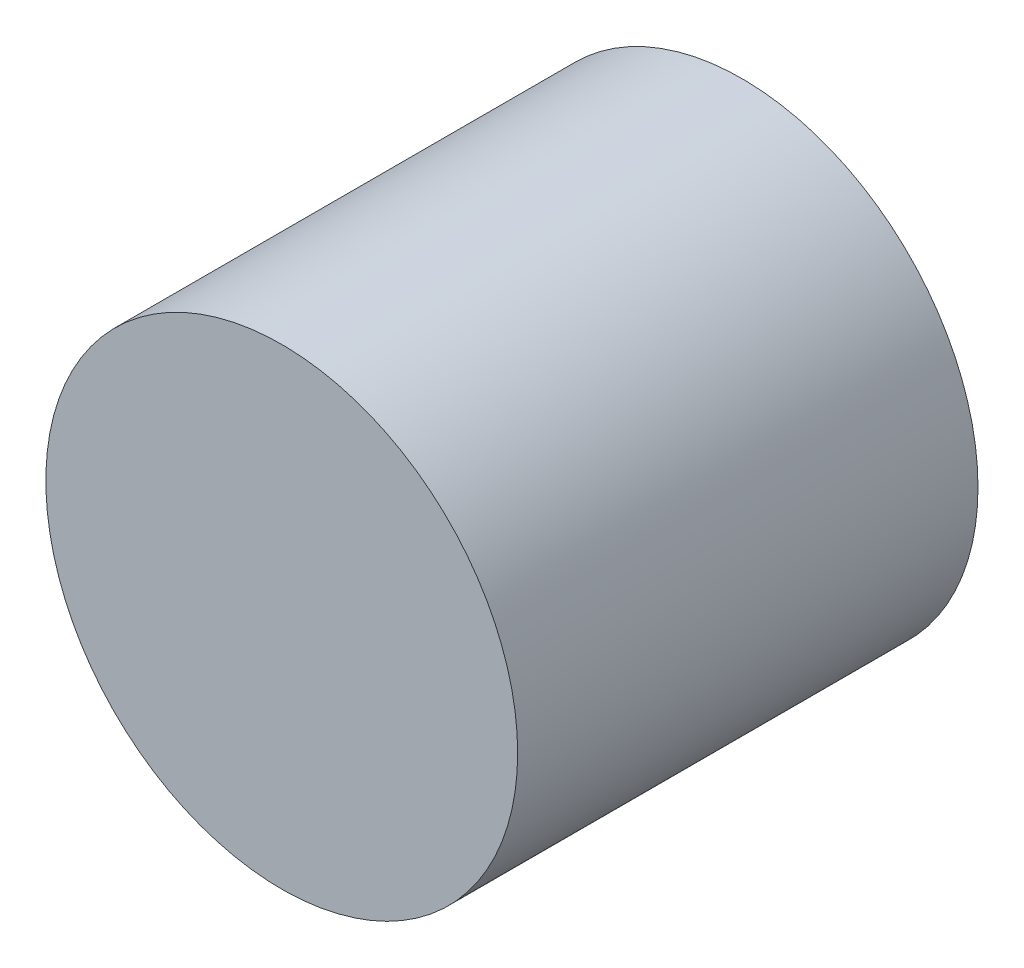
ISO-10303-21;
HEADER;
FILE_DESCRIPTION(('STEP AP214'),'2;1');
FILE_NAME('part.step','',(''),(''),'','','');
FILE_SCHEMA(('AUTOMOTIVE_DESIGN { 1 0 10303 214 1 1 1 1 }'));
ENDSEC;
DATA;
#1=APPLICATION_CONTEXT('core data for automotive mechanical design processes');
#2=APPLICATION_PROTOCOL_DEFINITION('international standard','automotive_design',2000,#1);
#3=PRODUCT_CONTEXT('',#1,'mechanical');
#4=PRODUCT('Part','Part','',(#3));
#5=PRODUCT_RELATED_PRODUCT_CATEGORY('part','',(#4));
#6=PRODUCT_DEFINITION_FORMATION('','',#4);
#7=PRODUCT_DEFINITION_CONTEXT('part definition',#1,'design');
#8=PRODUCT_DEFINITION('design','',#6,#7);
#9=PRODUCT_DEFINITION_SHAPE('','',#8);
#10=(LENGTH_UNIT() NAMED_UNIT(*) SI_UNIT(.MILLI.,.METRE.));
#11=(NAMED_UNIT(*) PLANE_ANGLE_UNIT() SI_UNIT($,.RADIAN.));
#12=(NAMED_UNIT(*) SI_UNIT($,.STERADIAN.) SOLID_ANGLE_UNIT());
#13=UNCERTAINTY_MEASURE_WITH_UNIT(LENGTH_MEASURE(1.E-05),#10,'distance_accuracy_value','');
#14=(GEOMETRIC_REPRESENTATION_CONTEXT(3) GLOBAL_UNCERTAINTY_ASSIGNED_CONTEXT((#13)) GLOBAL_UNIT_ASSIGNED_CONTEXT((#10,
#11,#12)) REPRESENTATION_CONTEXT('',''));
#15=CARTESIAN_POINT('',(0.,0.,0.));
#16=DIRECTION('',(0.,0.,1.));
#17=DIRECTION('',(1.,0.,0.));
#18=AXIS2_PLACEMENT_3D('',#15,#16,#17);
#19=CARTESIAN_POINT('',(0.,0.,0.));
#20=DIRECTION('',(0.,0.,1.));
#21=DIRECTION('',(1.,0.,0.));
#22=AXIS2_PLACEMENT_3D('',#19,#20,#21);
#23=PLANE('',#22);
#24=CARTESIAN_POINT('',(35.,0.,0.));
#25=DIRECTION('',(0.,0.,1.));
#26=DIRECTION('',(1.,0.,0.));
#27=AXIS2_PLACEMENT_3D('',#24,#25,#26);
#28=CIRCLE('',#27,4.1);
#29=CARTESIAN_POINT('',(39.1,0.,0.));
#30=VERTEX_POINT('',#29);
#31=EDGE_CURVE('E11',#30,#30,#28,.T.);
#32=ORIENTED_EDGE('',*,*,#31,.F.);
#33=EDGE_LOOP('',(#32));
#34=FACE_BOUND('',#33,.T.);
#35=ADVANCED_FACE('F40',(#34),#23,.F.);
#36=CARTESIAN_POINT('',(35.,0.,0.));
#37=DIRECTION('',(0.,0.,1.));
#38=DIRECTION('',(1.,0.,0.));
#39=AXIS2_PLACEMENT_3D('',#36,#37,#38);
#40=CYLINDRICAL_SURFACE('',#39,4.1);
#41=ORIENTED_EDGE('',*,*,#31,.T.);
#42=EDGE_LOOP('',(#41));
#43=FACE_BOUND('',#42,.T.);
#44=CARTESIAN_POINT('',(35.,0.,8.));
#45=DIRECTION('',(0.,0.,1.));
#46=DIRECTION('',(1.,0.,0.));
#47=AXIS2_PLACEMENT_3D('',#44,#45,#46);
#48=CIRCLE('',#47,4.1);
#49=CARTESIAN_POINT('',(39.1,0.,8.));
#50=VERTEX_POINT('',#49);
#51=EDGE_CURVE('E43',#50,#50,#48,.T.);
#52=ORIENTED_EDGE('',*,*,#51,.F.);
#53=EDGE_LOOP('',(#52));
#54=FACE_BOUND('',#53,.T.);
#55=ADVANCED_FACE('F54',(#43,#54),#40,.T.);
#56=CARTESIAN_POINT('',(0.,0.,8.));
#57=DIRECTION('',(0.,0.,1.));
#58=DIRECTION('',(1.,0.,0.));
#59=AXIS2_PLACEMENT_3D('',#56,#57,#58);
#60=PLANE('',#59);
#61=ORIENTED_EDGE('',*,*,#51,.T.);
#62=EDGE_LOOP('',(#61));
#63=FACE_BOUND('',#62,.T.);
#64=ADVANCED_FACE('F52',(#63),#60,.T.);
#65=CLOSED_SHELL('',(#35,#55,#64));
#66=MANIFOLD_SOLID_BREP('B2',#65);
#67=ADVANCED_BREP_SHAPE_REPRESENTATION('',(#18,#66),#14);
#68=SHAPE_DEFINITION_REPRESENTATION(#9,#67);
ENDSEC;
END-ISO-10303-21;
